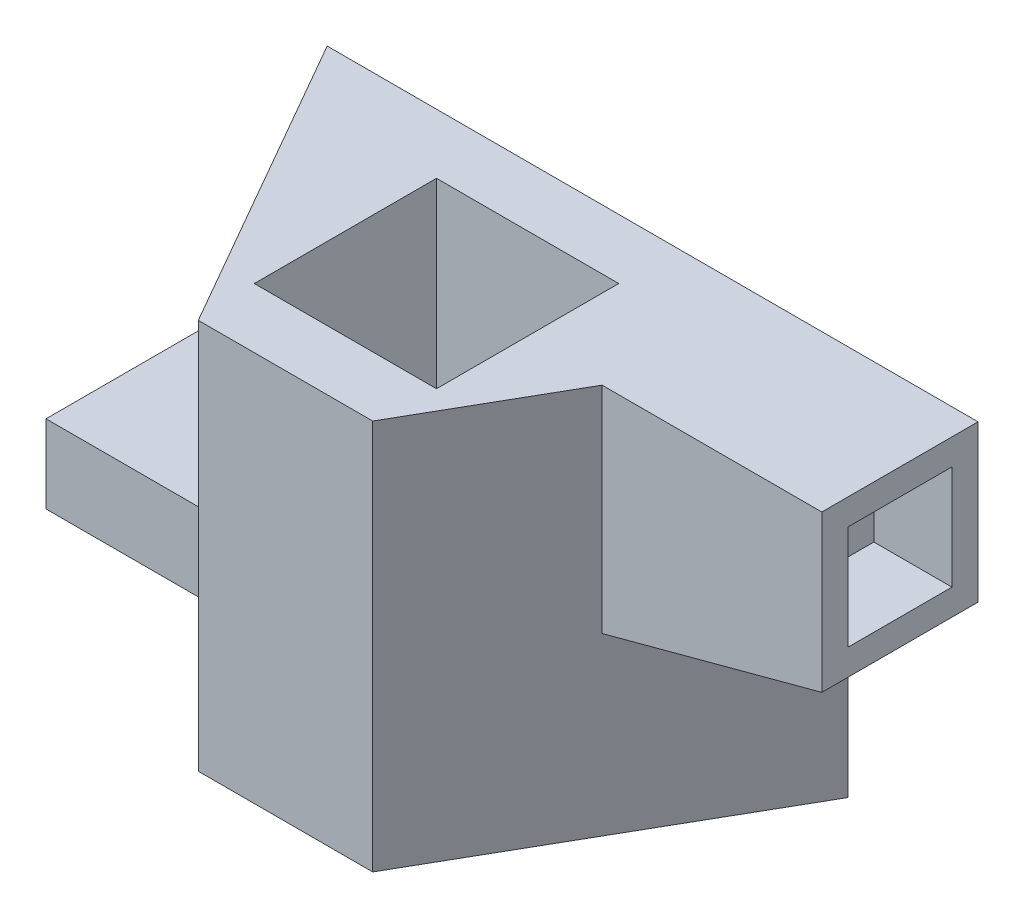
ISO-10303-21;
HEADER;
FILE_DESCRIPTION(('STEP AP214'),'2;1');
FILE_NAME('part.step','',(''),(''),'','','');
FILE_SCHEMA(('AUTOMOTIVE_DESIGN { 1 0 10303 214 1 1 1 1 }'));
ENDSEC;
DATA;
#1=APPLICATION_CONTEXT('core data for automotive mechanical design processes');
#2=APPLICATION_PROTOCOL_DEFINITION('international standard','automotive_design',2000,#1);
#3=PRODUCT_CONTEXT('',#1,'mechanical');
#4=PRODUCT('Part','Part','',(#3));
#5=PRODUCT_RELATED_PRODUCT_CATEGORY('part','',(#4));
#6=PRODUCT_DEFINITION_FORMATION('','',#4);
#7=PRODUCT_DEFINITION_CONTEXT('part definition',#1,'design');
#8=PRODUCT_DEFINITION('design','',#6,#7);
#9=PRODUCT_DEFINITION_SHAPE('','',#8);
#10=(LENGTH_UNIT() NAMED_UNIT(*) SI_UNIT(.MILLI.,.METRE.));
#11=(NAMED_UNIT(*) PLANE_ANGLE_UNIT() SI_UNIT($,.RADIAN.));
#12=(NAMED_UNIT(*) SI_UNIT($,.STERADIAN.) SOLID_ANGLE_UNIT());
#13=UNCERTAINTY_MEASURE_WITH_UNIT(LENGTH_MEASURE(1.E-05),#10,'distance_accuracy_value','');
#14=(GEOMETRIC_REPRESENTATION_CONTEXT(3) GLOBAL_UNCERTAINTY_ASSIGNED_CONTEXT((#13)) GLOBAL_UNIT_ASSIGNED_CONTEXT((#10,
#11,#12)) REPRESENTATION_CONTEXT('',''));
#15=CARTESIAN_POINT('',(0.,0.,0.));
#16=DIRECTION('',(0.,0.,1.));
#17=DIRECTION('',(1.,0.,0.));
#18=AXIS2_PLACEMENT_3D('',#15,#16,#17);
#19=CARTESIAN_POINT('',(0.,-30.,0.));
#20=DIRECTION('',(0.867551941954088,0.,0.497346587413335));
#21=DIRECTION('',(0.497346587413335,0.,-0.867551941954089));
#22=AXIS2_PLACEMENT_3D('',#19,#20,#21);
#23=PLANE('',#22);
#24=DIRECTION('',(0.492988315165272,0.132095820926511,-0.859949542243182));
#25=VECTOR('',#24,1.);
#26=CARTESIAN_POINT('',(-4.98848736259163,45.2658792181849,8.7017223167012));
#27=LINE('',#26,#25);
#28=CARTESIAN_POINT('',(-34.3965517241379,37.3860121215463,60.));
#29=VERTEX_POINT('',#28);
#30=CARTESIAN_POINT('',(0.,46.6025403784442,0.));
#31=VERTEX_POINT('',#30);
#32=EDGE_CURVE('E591',#29,#31,#27,.T.);
#33=ORIENTED_EDGE('',*,*,#32,.F.);
#34=DIRECTION('',(0.,-1.,0.));
#35=VECTOR('',#34,1.);
#36=CARTESIAN_POINT('',(-34.3965517241379,0.,60.));
#37=LINE('',#36,#35);
#38=CARTESIAN_POINT('',(-34.3965517241379,120.,60.));
#39=VERTEX_POINT('',#38);
#40=EDGE_CURVE('E63',#39,#29,#37,.T.);
#41=ORIENTED_EDGE('',*,*,#40,.F.);
#42=DIRECTION('',(0.497346587413335,0.,-0.867551941954089));
#43=VECTOR('',#42,1.);
#44=CARTESIAN_POINT('',(0.,120.,0.));
#45=LINE('',#44,#43);
#46=CARTESIAN_POINT('',(-66.5,120.,116.));
#47=VERTEX_POINT('',#46);
#48=EDGE_CURVE('E206',#47,#39,#45,.T.);
#49=ORIENTED_EDGE('',*,*,#48,.F.);
#50=DIRECTION('',(0.,1.,0.));
#51=VECTOR('',#50,1.);
#52=CARTESIAN_POINT('',(-66.5,-30.,116.));
#53=LINE('',#52,#51);
#54=CARTESIAN_POINT('',(-66.5,-30.,116.));
#55=VERTEX_POINT('',#54);
#56=EDGE_CURVE('E292',#55,#47,#53,.T.);
#57=ORIENTED_EDGE('',*,*,#56,.F.);
#58=DIRECTION('',(0.497346587413335,0.,-0.867551941954088));
#59=VECTOR('',#58,1.);
#60=CARTESIAN_POINT('',(0.,-30.,0.));
#61=LINE('',#60,#59);
#62=CARTESIAN_POINT('',(0.,-30.,0.));
#63=VERTEX_POINT('',#62);
#64=EDGE_CURVE('E238',#55,#63,#61,.T.);
#65=ORIENTED_EDGE('',*,*,#64,.T.);
#66=DIRECTION('',(0.,1.,0.));
#67=VECTOR('',#66,1.);
#68=CARTESIAN_POINT('',(0.,-30.,0.));
#69=LINE('',#68,#67);
#70=EDGE_CURVE('E289',#63,#31,#69,.T.);
#71=ORIENTED_EDGE('',*,*,#70,.T.);
#72=EDGE_LOOP('',(#33,#41,#49,#57,#65,#71));
#73=FACE_BOUND('',#72,.T.);
#74=ADVANCED_FACE('F38',(#73),#23,.T.);
#75=CARTESIAN_POINT('',(0.,0.,0.));
#76=DIRECTION('',(0.,1.,0.));
#77=DIRECTION('',(0.,0.,1.));
#78=AXIS2_PLACEMENT_3D('',#75,#76,#77);
#79=PLANE('',#78);
#80=DIRECTION('',(1.,0.,0.));
#81=VECTOR('',#80,1.);
#82=CARTESIAN_POINT('',(0.,0.,58.));
#83=LINE('',#82,#81);
#84=CARTESIAN_POINT('',(-250.,0.,58.));
#85=VERTEX_POINT('',#84);
#86=CARTESIAN_POINT('',(-166.75,0.,58.0000000000001));
#87=VERTEX_POINT('',#86);
#88=EDGE_CURVE('E228',#85,#87,#83,.T.);
#89=ORIENTED_EDGE('',*,*,#88,.T.);
#90=DIRECTION('',(-0.497346587413335,0.,-0.867551941954088));
#91=VECTOR('',#90,1.);
#92=CARTESIAN_POINT('',(-150.529274397662,0.,86.2947995469355));
#93=LINE('',#92,#91);
#94=CARTESIAN_POINT('',(-200.,0.,0.));
#95=VERTEX_POINT('',#94);
#96=EDGE_CURVE('E12',#87,#95,#93,.T.);
#97=ORIENTED_EDGE('',*,*,#96,.T.);
#98=DIRECTION('',(0.,0.,-1.));
#99=VECTOR('',#98,1.);
#100=CARTESIAN_POINT('',(-200.,0.,0.));
#101=LINE('',#100,#99);
#102=CARTESIAN_POINT('',(-200.,0.,-80.));
#103=VERTEX_POINT('',#102);
#104=EDGE_CURVE('E265',#95,#103,#101,.T.);
#105=ORIENTED_EDGE('',*,*,#104,.T.);
#106=DIRECTION('',(-1.,0.,0.));
#107=VECTOR('',#106,1.);
#108=CARTESIAN_POINT('',(0.,0.,-80.));
#109=LINE('',#108,#107);
#110=CARTESIAN_POINT('',(-250.,0.,-80.));
#111=VERTEX_POINT('',#110);
#112=EDGE_CURVE('E268',#103,#111,#109,.T.);
#113=ORIENTED_EDGE('',*,*,#112,.T.);
#114=DIRECTION('',(0.,0.,1.));
#115=VECTOR('',#114,1.);
#116=CARTESIAN_POINT('',(-250.,0.,0.));
#117=LINE('',#116,#115);
#118=EDGE_CURVE('E233',#111,#85,#117,.T.);
#119=ORIENTED_EDGE('',*,*,#118,.T.);
#120=EDGE_LOOP('',(#89,#97,#105,#113,#119));
#121=FACE_BOUND('',#120,.T.);
#122=ADVANCED_FACE('F303',(#121),#79,.T.);
#123=CARTESIAN_POINT('',(-65.,-30.,0.));
#124=DIRECTION('',(1.,0.,0.));
#125=DIRECTION('',(0.,0.,-1.));
#126=AXIS2_PLACEMENT_3D('',#123,#124,#125);
#127=PLANE('',#126);
#128=DIRECTION('',(0.,1.,0.));
#129=VECTOR('',#128,1.);
#130=CARTESIAN_POINT('',(-65.,-30.,93.));
#131=LINE('',#130,#129);
#132=CARTESIAN_POINT('',(-65.,-30.,93.));
#133=VERTEX_POINT('',#132);
#134=CARTESIAN_POINT('',(-65.,120.,93.));
#135=VERTEX_POINT('',#134);
#136=EDGE_CURVE('E278',#133,#135,#131,.T.);
#137=ORIENTED_EDGE('',*,*,#136,.T.);
#138=DIRECTION('',(0.,0.,-1.));
#139=VECTOR('',#138,1.);
#140=CARTESIAN_POINT('',(-65.,120.,0.));
#141=LINE('',#140,#139);
#142=CARTESIAN_POINT('',(-65.,120.,23.));
#143=VERTEX_POINT('',#142);
#144=EDGE_CURVE('E220',#135,#143,#141,.T.);
#145=ORIENTED_EDGE('',*,*,#144,.T.);
#146=DIRECTION('',(0.,1.,0.));
#147=VECTOR('',#146,1.);
#148=CARTESIAN_POINT('',(-65.,-30.,23.));
#149=LINE('',#148,#147);
#150=CARTESIAN_POINT('',(-65.,-30.,23.));
#151=VERTEX_POINT('',#150);
#152=EDGE_CURVE('E47',#151,#143,#149,.T.);
#153=ORIENTED_EDGE('',*,*,#152,.F.);
#154=DIRECTION('',(0.,0.,-1.));
#155=VECTOR('',#154,1.);
#156=CARTESIAN_POINT('',(-65.,-30.,0.));
#157=LINE('',#156,#155);
#158=EDGE_CURVE('E253',#133,#151,#157,.T.);
#159=ORIENTED_EDGE('',*,*,#158,.F.);
#160=EDGE_LOOP('',(#137,#145,#153,#159));
#161=FACE_BOUND('',#160,.T.);
#162=ADVANCED_FACE('F333',(#161),#127,.F.);
#163=CARTESIAN_POINT('',(0.,-30.,23.));
#164=DIRECTION('',(0.,0.,1.));
#165=DIRECTION('',(1.,0.,0.));
#166=AXIS2_PLACEMENT_3D('',#163,#164,#165);
#167=PLANE('',#166);
#168=ORIENTED_EDGE('',*,*,#152,.T.);
#169=DIRECTION('',(1.,0.,0.));
#170=VECTOR('',#169,1.);
#171=CARTESIAN_POINT('',(0.,120.,23.));
#172=LINE('',#171,#170);
#173=CARTESIAN_POINT('',(-135.,120.,23.));
#174=VERTEX_POINT('',#173);
#175=EDGE_CURVE('E211',#174,#143,#172,.T.);
#176=ORIENTED_EDGE('',*,*,#175,.F.);
#177=DIRECTION('',(0.,1.,0.));
#178=VECTOR('',#177,1.);
#179=CARTESIAN_POINT('',(-135.,-30.,23.));
#180=LINE('',#179,#178);
#181=CARTESIAN_POINT('',(-135.,-30.,23.));
#182=VERTEX_POINT('',#181);
#183=EDGE_CURVE('E274',#182,#174,#180,.T.);
#184=ORIENTED_EDGE('',*,*,#183,.F.);
#185=DIRECTION('',(1.,0.,0.));
#186=VECTOR('',#185,1.);
#187=CARTESIAN_POINT('',(0.,-30.,23.));
#188=LINE('',#187,#186);
#189=EDGE_CURVE('E260',#182,#151,#188,.T.);
#190=ORIENTED_EDGE('',*,*,#189,.T.);
#191=EDGE_LOOP('',(#168,#176,#184,#190));
#192=FACE_BOUND('',#191,.T.);
#193=ADVANCED_FACE('F350',(#192),#167,.T.);
#194=CARTESIAN_POINT('',(-135.,-30.,0.));
#195=DIRECTION('',(1.,0.,0.));
#196=DIRECTION('',(0.,0.,-1.));
#197=AXIS2_PLACEMENT_3D('',#194,#195,#196);
#198=PLANE('',#197);
#199=ORIENTED_EDGE('',*,*,#183,.T.);
#200=DIRECTION('',(0.,0.,-1.));
#201=VECTOR('',#200,1.);
#202=CARTESIAN_POINT('',(-135.,120.,0.));
#203=LINE('',#202,#201);
#204=CARTESIAN_POINT('',(-135.,120.,93.));
#205=VERTEX_POINT('',#204);
#206=EDGE_CURVE('E214',#205,#174,#203,.T.);
#207=ORIENTED_EDGE('',*,*,#206,.F.);
#208=DIRECTION('',(0.,1.,0.));
#209=VECTOR('',#208,1.);
#210=CARTESIAN_POINT('',(-135.,-30.,93.));
#211=LINE('',#210,#209);
#212=CARTESIAN_POINT('',(-135.,-30.,93.));
#213=VERTEX_POINT('',#212);
#214=EDGE_CURVE('E276',#213,#205,#211,.T.);
#215=ORIENTED_EDGE('',*,*,#214,.F.);
#216=DIRECTION('',(0.,0.,-1.));
#217=VECTOR('',#216,1.);
#218=CARTESIAN_POINT('',(-135.,-30.,0.));
#219=LINE('',#218,#217);
#220=EDGE_CURVE('E257',#213,#182,#219,.T.);
#221=ORIENTED_EDGE('',*,*,#220,.T.);
#222=EDGE_LOOP('',(#199,#207,#215,#221));
#223=FACE_BOUND('',#222,.T.);
#224=ADVANCED_FACE('F353',(#223),#198,.T.);
#225=CARTESIAN_POINT('',(0.,-30.,58.));
#226=DIRECTION('',(0.,0.,1.));
#227=DIRECTION('',(1.,0.,0.));
#228=AXIS2_PLACEMENT_3D('',#225,#226,#227);
#229=PLANE('',#228);
#230=ORIENTED_EDGE('',*,*,#88,.F.);
#231=DIRECTION('',(0.,1.,0.));
#232=VECTOR('',#231,1.);
#233=CARTESIAN_POINT('',(-250.,-30.,58.));
#234=LINE('',#233,#232);
#235=CARTESIAN_POINT('',(-250.,-30.,58.));
#236=VERTEX_POINT('',#235);
#237=EDGE_CURVE('E280',#236,#85,#234,.T.);
#238=ORIENTED_EDGE('',*,*,#237,.F.);
#239=DIRECTION('',(1.,0.,0.));
#240=VECTOR('',#239,1.);
#241=CARTESIAN_POINT('',(0.,-30.,58.));
#242=LINE('',#241,#240);
#243=CARTESIAN_POINT('',(-166.75,-30.,58.));
#244=VERTEX_POINT('',#243);
#245=EDGE_CURVE('E229',#236,#244,#242,.T.);
#246=ORIENTED_EDGE('',*,*,#245,.T.);
#247=DIRECTION('',(0.,1.,0.));
#248=VECTOR('',#247,1.);
#249=CARTESIAN_POINT('',(-166.75,-30.,58.));
#250=LINE('',#249,#248);
#251=EDGE_CURVE('E42',#244,#87,#250,.T.);
#252=ORIENTED_EDGE('',*,*,#251,.T.);
#253=EDGE_LOOP('',(#230,#238,#246,#252));
#254=FACE_BOUND('',#253,.T.);
#255=ADVANCED_FACE('F40',(#254),#229,.T.);
#256=CARTESIAN_POINT('',(-250.,-30.,0.));
#257=DIRECTION('',(-1.,0.,0.));
#258=DIRECTION('',(0.,0.,1.));
#259=AXIS2_PLACEMENT_3D('',#256,#257,#258);
#260=PLANE('',#259);
#261=ORIENTED_EDGE('',*,*,#118,.F.);
#262=DIRECTION('',(0.,1.,0.));
#263=VECTOR('',#262,1.);
#264=CARTESIAN_POINT('',(-250.,-30.,-80.));
#265=LINE('',#264,#263);
#266=CARTESIAN_POINT('',(-250.,-30.,-80.));
#267=VERTEX_POINT('',#266);
#268=EDGE_CURVE('E282',#267,#111,#265,.T.);
#269=ORIENTED_EDGE('',*,*,#268,.F.);
#270=DIRECTION('',(0.,0.,1.));
#271=VECTOR('',#270,1.);
#272=CARTESIAN_POINT('',(-250.,-30.,0.));
#273=LINE('',#272,#271);
#274=EDGE_CURVE('E250',#267,#236,#273,.T.);
#275=ORIENTED_EDGE('',*,*,#274,.T.);
#276=ORIENTED_EDGE('',*,*,#237,.T.);
#277=EDGE_LOOP('',(#261,#269,#275,#276));
#278=FACE_BOUND('',#277,.T.);
#279=ADVANCED_FACE('F307',(#278),#260,.T.);
#280=CARTESIAN_POINT('',(0.,-30.,-80.));
#281=DIRECTION('',(0.,0.,-1.));
#282=DIRECTION('',(-1.,0.,0.));
#283=AXIS2_PLACEMENT_3D('',#280,#281,#282);
#284=PLANE('',#283);
#285=ORIENTED_EDGE('',*,*,#112,.F.);
#286=DIRECTION('',(0.,1.,0.));
#287=VECTOR('',#286,1.);
#288=CARTESIAN_POINT('',(-200.,-30.,-80.));
#289=LINE('',#288,#287);
#290=CARTESIAN_POINT('',(-200.,-30.,-80.));
#291=VERTEX_POINT('',#290);
#292=EDGE_CURVE('E284',#291,#103,#289,.T.);
#293=ORIENTED_EDGE('',*,*,#292,.F.);
#294=DIRECTION('',(-1.,0.,0.));
#295=VECTOR('',#294,1.);
#296=CARTESIAN_POINT('',(0.,-30.,-80.));
#297=LINE('',#296,#295);
#298=EDGE_CURVE('E247',#291,#267,#297,.T.);
#299=ORIENTED_EDGE('',*,*,#298,.T.);
#300=ORIENTED_EDGE('',*,*,#268,.T.);
#301=EDGE_LOOP('',(#285,#293,#299,#300));
#302=FACE_BOUND('',#301,.T.);
#303=ADVANCED_FACE('F342',(#302),#284,.T.);
#304=CARTESIAN_POINT('',(-200.,-30.,0.));
#305=DIRECTION('',(1.,0.,0.));
#306=DIRECTION('',(0.,0.,-1.));
#307=AXIS2_PLACEMENT_3D('',#304,#305,#306);
#308=PLANE('',#307);
#309=ORIENTED_EDGE('',*,*,#104,.F.);
#310=DIRECTION('',(0.,1.,0.));
#311=VECTOR('',#310,1.);
#312=CARTESIAN_POINT('',(-200.,-30.,0.));
#313=LINE('',#312,#311);
#314=CARTESIAN_POINT('',(-200.,-30.,0.));
#315=VERTEX_POINT('',#314);
#316=EDGE_CURVE('E286',#315,#95,#313,.T.);
#317=ORIENTED_EDGE('',*,*,#316,.F.);
#318=DIRECTION('',(0.,0.,-1.));
#319=VECTOR('',#318,1.);
#320=CARTESIAN_POINT('',(-200.,-30.,0.));
#321=LINE('',#320,#319);
#322=EDGE_CURVE('E244',#315,#291,#321,.T.);
#323=ORIENTED_EDGE('',*,*,#322,.T.);
#324=ORIENTED_EDGE('',*,*,#292,.T.);
#325=EDGE_LOOP('',(#309,#317,#323,#324));
#326=FACE_BOUND('',#325,.T.);
#327=ADVANCED_FACE('F338',(#326),#308,.T.);
#328=CARTESIAN_POINT('',(0.,-30.,0.));
#329=DIRECTION('',(0.,0.,-1.));
#330=DIRECTION('',(-1.,0.,0.));
#331=AXIS2_PLACEMENT_3D('',#328,#329,#330);
#332=PLANE('',#331);
#333=DIRECTION('',(0.96592582628907,0.258819045102515,0.));
#334=VECTOR('',#333,1.);
#335=CARTESIAN_POINT('',(50.,60.,0.));
#336=LINE('',#335,#334);
#337=CARTESIAN_POINT('',(50.,60.,0.));
#338=VERTEX_POINT('',#337);
#339=EDGE_CURVE('E180',#31,#338,#336,.T.);
#340=ORIENTED_EDGE('',*,*,#339,.F.);
#341=ORIENTED_EDGE('',*,*,#70,.F.);
#342=DIRECTION('',(-1.,0.,0.));
#343=VECTOR('',#342,1.);
#344=CARTESIAN_POINT('',(0.,-30.,0.));
#345=LINE('',#344,#343);
#346=EDGE_CURVE('E241',#63,#315,#345,.T.);
#347=ORIENTED_EDGE('',*,*,#346,.T.);
#348=ORIENTED_EDGE('',*,*,#316,.T.);
#349=DIRECTION('',(0.,-1.,0.));
#350=VECTOR('',#349,1.);
#351=CARTESIAN_POINT('',(-200.,501.205536265895,0.));
#352=LINE('',#351,#350);
#353=CARTESIAN_POINT('',(-200.,120.,0.));
#354=VERTEX_POINT('',#353);
#355=EDGE_CURVE('E222',#354,#95,#352,.T.);
#356=ORIENTED_EDGE('',*,*,#355,.F.);
#357=DIRECTION('',(-1.,0.,0.));
#358=VECTOR('',#357,1.);
#359=CARTESIAN_POINT('',(0.,120.,0.));
#360=LINE('',#359,#358);
#361=CARTESIAN_POINT('',(50.,120.,0.));
#362=VERTEX_POINT('',#361);
#363=EDGE_CURVE('E204',#362,#354,#360,.T.);
#364=ORIENTED_EDGE('',*,*,#363,.F.);
#365=DIRECTION('',(0.,1.,0.));
#366=VECTOR('',#365,1.);
#367=CARTESIAN_POINT('',(50.,0.,0.));
#368=LINE('',#367,#366);
#369=EDGE_CURVE('E185',#338,#362,#368,.T.);
#370=ORIENTED_EDGE('',*,*,#369,.F.);
#371=EDGE_LOOP('',(#340,#341,#347,#348,#356,#364,#370));
#372=FACE_BOUND('',#371,.T.);
#373=ADVANCED_FACE('F325',(#372),#332,.T.);
#374=CARTESIAN_POINT('',(0.,-30.,116.));
#375=DIRECTION('',(0.,0.,1.));
#376=DIRECTION('',(1.,0.,0.));
#377=AXIS2_PLACEMENT_3D('',#374,#375,#376);
#378=PLANE('',#377);
#379=ORIENTED_EDGE('',*,*,#56,.T.);
#380=DIRECTION('',(1.,0.,0.));
#381=VECTOR('',#380,1.);
#382=CARTESIAN_POINT('',(0.,120.,116.));
#383=LINE('',#382,#381);
#384=CARTESIAN_POINT('',(-133.5,120.,116.));
#385=VERTEX_POINT('',#384);
#386=EDGE_CURVE('E208',#385,#47,#383,.T.);
#387=ORIENTED_EDGE('',*,*,#386,.F.);
#388=DIRECTION('',(0.,1.,0.));
#389=VECTOR('',#388,1.);
#390=CARTESIAN_POINT('',(-133.5,-30.,116.));
#391=LINE('',#390,#389);
#392=CARTESIAN_POINT('',(-133.5,-30.,116.));
#393=VERTEX_POINT('',#392);
#394=EDGE_CURVE('E293',#393,#385,#391,.T.);
#395=ORIENTED_EDGE('',*,*,#394,.F.);
#396=DIRECTION('',(1.,0.,0.));
#397=VECTOR('',#396,1.);
#398=CARTESIAN_POINT('',(0.,-30.,116.));
#399=LINE('',#398,#397);
#400=EDGE_CURVE('E235',#393,#55,#399,.T.);
#401=ORIENTED_EDGE('',*,*,#400,.T.);
#402=EDGE_LOOP('',(#379,#387,#395,#401));
#403=FACE_BOUND('',#402,.T.);
#404=ADVANCED_FACE('F318',(#403),#378,.T.);
#405=CARTESIAN_POINT('',(-150.529274397662,-30.,86.2947995469355));
#406=DIRECTION('',(0.867551941954088,0.,-0.497346587413335));
#407=DIRECTION('',(-0.497346587413335,0.,-0.867551941954089));
#408=AXIS2_PLACEMENT_3D('',#405,#406,#407);
#409=PLANE('',#408);
#410=ORIENTED_EDGE('',*,*,#394,.T.);
#411=DIRECTION('',(-0.497346587413335,0.,-0.867551941954088));
#412=VECTOR('',#411,1.);
#413=CARTESIAN_POINT('',(-150.529274397662,120.,86.2947995469355));
#414=LINE('',#413,#412);
#415=EDGE_CURVE('E225',#385,#354,#414,.T.);
#416=ORIENTED_EDGE('',*,*,#415,.T.);
#417=ORIENTED_EDGE('',*,*,#355,.T.);
#418=ORIENTED_EDGE('',*,*,#96,.F.);
#419=ORIENTED_EDGE('',*,*,#251,.F.);
#420=DIRECTION('',(-0.497346587413335,0.,-0.867551941954088));
#421=VECTOR('',#420,1.);
#422=CARTESIAN_POINT('',(-150.529274397662,-30.,86.2947995469355));
#423=LINE('',#422,#421);
#424=EDGE_CURVE('E232',#393,#244,#423,.T.);
#425=ORIENTED_EDGE('',*,*,#424,.F.);
#426=EDGE_LOOP('',(#410,#416,#417,#418,#419,#425));
#427=FACE_BOUND('',#426,.T.);
#428=ADVANCED_FACE('F315',(#427),#409,.F.);
#429=CARTESIAN_POINT('',(0.,-30.,93.));
#430=DIRECTION('',(0.,0.,1.));
#431=DIRECTION('',(1.,0.,0.));
#432=AXIS2_PLACEMENT_3D('',#429,#430,#431);
#433=PLANE('',#432);
#434=ORIENTED_EDGE('',*,*,#214,.T.);
#435=DIRECTION('',(1.,0.,0.));
#436=VECTOR('',#435,1.);
#437=CARTESIAN_POINT('',(0.,120.,93.));
#438=LINE('',#437,#436);
#439=EDGE_CURVE('E217',#205,#135,#438,.T.);
#440=ORIENTED_EDGE('',*,*,#439,.T.);
#441=ORIENTED_EDGE('',*,*,#136,.F.);
#442=DIRECTION('',(1.,0.,0.));
#443=VECTOR('',#442,1.);
#444=CARTESIAN_POINT('',(0.,-30.,93.));
#445=LINE('',#444,#443);
#446=EDGE_CURVE('E255',#213,#133,#445,.T.);
#447=ORIENTED_EDGE('',*,*,#446,.F.);
#448=EDGE_LOOP('',(#434,#440,#441,#447));
#449=FACE_BOUND('',#448,.T.);
#450=ADVANCED_FACE('F317',(#449),#433,.F.);
#451=CARTESIAN_POINT('',(0.,-30.,0.));
#452=DIRECTION('',(0.,1.,0.));
#453=DIRECTION('',(0.,0.,1.));
#454=AXIS2_PLACEMENT_3D('',#451,#452,#453);
#455=PLANE('',#454);
#456=ORIENTED_EDGE('',*,*,#245,.F.);
#457=ORIENTED_EDGE('',*,*,#274,.F.);
#458=ORIENTED_EDGE('',*,*,#298,.F.);
#459=ORIENTED_EDGE('',*,*,#322,.F.);
#460=ORIENTED_EDGE('',*,*,#346,.F.);
#461=ORIENTED_EDGE('',*,*,#64,.F.);
#462=ORIENTED_EDGE('',*,*,#400,.F.);
#463=ORIENTED_EDGE('',*,*,#424,.T.);
#464=EDGE_LOOP('',(#456,#457,#458,#459,#460,#461,#462,#463));
#465=FACE_BOUND('',#464,.T.);
#466=ORIENTED_EDGE('',*,*,#158,.T.);
#467=ORIENTED_EDGE('',*,*,#189,.F.);
#468=ORIENTED_EDGE('',*,*,#220,.F.);
#469=ORIENTED_EDGE('',*,*,#446,.T.);
#470=EDGE_LOOP('',(#466,#467,#468,#469));
#471=FACE_BOUND('',#470,.T.);
#472=ADVANCED_FACE('F310',(#465,#471),#455,.F.);
#473=CARTESIAN_POINT('',(0.,120.,0.));
#474=DIRECTION('',(0.,1.,0.));
#475=DIRECTION('',(0.,0.,1.));
#476=AXIS2_PLACEMENT_3D('',#473,#474,#475);
#477=PLANE('',#476);
#478=ORIENTED_EDGE('',*,*,#144,.F.);
#479=ORIENTED_EDGE('',*,*,#439,.F.);
#480=ORIENTED_EDGE('',*,*,#206,.T.);
#481=ORIENTED_EDGE('',*,*,#175,.T.);
#482=EDGE_LOOP('',(#478,#479,#480,#481));
#483=FACE_BOUND('',#482,.T.);
#484=ORIENTED_EDGE('',*,*,#415,.F.);
#485=ORIENTED_EDGE('',*,*,#386,.T.);
#486=ORIENTED_EDGE('',*,*,#48,.T.);
#487=DIRECTION('',(1.,0.,0.));
#488=VECTOR('',#487,1.);
#489=CARTESIAN_POINT('',(-108.528275497553,120.,60.));
#490=LINE('',#489,#488);
#491=CARTESIAN_POINT('',(50.,120.,60.));
#492=VERTEX_POINT('',#491);
#493=EDGE_CURVE('E198',#39,#492,#490,.T.);
#494=ORIENTED_EDGE('',*,*,#493,.T.);
#495=DIRECTION('',(0.,0.,-1.));
#496=VECTOR('',#495,1.);
#497=CARTESIAN_POINT('',(50.,120.,0.));
#498=LINE('',#497,#496);
#499=EDGE_CURVE('E197',#492,#362,#498,.T.);
#500=ORIENTED_EDGE('',*,*,#499,.T.);
#501=ORIENTED_EDGE('',*,*,#363,.T.);
#502=EDGE_LOOP('',(#484,#485,#486,#494,#500,#501));
#503=FACE_BOUND('',#502,.T.);
#504=ADVANCED_FACE('F362',(#483,#503),#477,.T.);
#505=CARTESIAN_POINT('',(-108.528275497553,0.,60.));
#506=DIRECTION('',(0.,0.,-1.));
#507=DIRECTION('',(0.,1.,0.));
#508=AXIS2_PLACEMENT_3D('',#505,#506,#507);
#509=PLANE('',#508);
#510=ORIENTED_EDGE('',*,*,#493,.F.);
#511=ORIENTED_EDGE('',*,*,#40,.T.);
#512=DIRECTION('',(0.96592582628907,0.258819045102515,0.));
#513=VECTOR('',#512,1.);
#514=CARTESIAN_POINT('',(50.,60.,60.));
#515=LINE('',#514,#513);
#516=CARTESIAN_POINT('',(50.,60.,60.));
#517=VERTEX_POINT('',#516);
#518=EDGE_CURVE('E178',#29,#517,#515,.T.);
#519=ORIENTED_EDGE('',*,*,#518,.T.);
#520=DIRECTION('',(0.,1.,0.));
#521=VECTOR('',#520,1.);
#522=CARTESIAN_POINT('',(50.,0.,60.));
#523=LINE('',#522,#521);
#524=EDGE_CURVE('E192',#517,#492,#523,.T.);
#525=ORIENTED_EDGE('',*,*,#524,.T.);
#526=EDGE_LOOP('',(#510,#511,#519,#525));
#527=FACE_BOUND('',#526,.T.);
#528=ADVANCED_FACE('F191',(#527),#509,.F.);
#529=CARTESIAN_POINT('',(50.,0.,0.));
#530=DIRECTION('',(1.,0.,0.));
#531=DIRECTION('',(0.,0.,-1.));
#532=AXIS2_PLACEMENT_3D('',#529,#530,#531);
#533=PLANE('',#532);
#534=DIRECTION('',(0.,0.,-1.));
#535=VECTOR('',#534,1.);
#536=CARTESIAN_POINT('',(50.,70.,0.));
#537=LINE('',#536,#535);
#538=CARTESIAN_POINT('',(50.,70.,50.));
#539=VERTEX_POINT('',#538);
#540=CARTESIAN_POINT('',(50.,70.,9.99999999999999));
#541=VERTEX_POINT('',#540);
#542=EDGE_CURVE('E55',#539,#541,#537,.T.);
#543=ORIENTED_EDGE('',*,*,#542,.F.);
#544=DIRECTION('',(0.,1.,0.));
#545=VECTOR('',#544,1.);
#546=CARTESIAN_POINT('',(50.,0.,50.));
#547=LINE('',#546,#545);
#548=CARTESIAN_POINT('',(50.,110.,50.));
#549=VERTEX_POINT('',#548);
#550=EDGE_CURVE('E583',#539,#549,#547,.T.);
#551=ORIENTED_EDGE('',*,*,#550,.T.);
#552=DIRECTION('',(0.,0.,-1.));
#553=VECTOR('',#552,1.);
#554=CARTESIAN_POINT('',(50.,110.,0.));
#555=LINE('',#554,#553);
#556=CARTESIAN_POINT('',(50.,110.,9.99999999999999));
#557=VERTEX_POINT('',#556);
#558=EDGE_CURVE('E588',#549,#557,#555,.T.);
#559=ORIENTED_EDGE('',*,*,#558,.T.);
#560=DIRECTION('',(0.,1.,0.));
#561=VECTOR('',#560,1.);
#562=CARTESIAN_POINT('',(50.,0.,9.99999999999999));
#563=LINE('',#562,#561);
#564=EDGE_CURVE('E598',#541,#557,#563,.T.);
#565=ORIENTED_EDGE('',*,*,#564,.F.);
#566=EDGE_LOOP('',(#543,#551,#559,#565));
#567=FACE_BOUND('',#566,.T.);
#568=DIRECTION('',(0.,0.,-1.));
#569=VECTOR('',#568,1.);
#570=CARTESIAN_POINT('',(50.,60.,0.));
#571=LINE('',#570,#569);
#572=EDGE_CURVE('E175',#517,#338,#571,.T.);
#573=ORIENTED_EDGE('',*,*,#572,.T.);
#574=ORIENTED_EDGE('',*,*,#369,.T.);
#575=ORIENTED_EDGE('',*,*,#499,.F.);
#576=ORIENTED_EDGE('',*,*,#524,.F.);
#577=EDGE_LOOP('',(#573,#574,#575,#576));
#578=FACE_BOUND('',#577,.T.);
#579=ADVANCED_FACE('F195',(#567,#578),#533,.T.);
#580=CARTESIAN_POINT('',(20.,70.,0.));
#581=DIRECTION('',(0.,-1.,0.));
#582=DIRECTION('',(0.,0.,-1.));
#583=AXIS2_PLACEMENT_3D('',#580,#581,#582);
#584=PLANE('',#583);
#585=ORIENTED_EDGE('',*,*,#542,.T.);
#586=DIRECTION('',(1.,0.,0.));
#587=VECTOR('',#586,1.);
#588=CARTESIAN_POINT('',(20.,70.,9.99999999999999));
#589=LINE('',#588,#587);
#590=CARTESIAN_POINT('',(20.,70.,9.99999999999999));
#591=VERTEX_POINT('',#590);
#592=EDGE_CURVE('E596',#591,#541,#589,.T.);
#593=ORIENTED_EDGE('',*,*,#592,.F.);
#594=DIRECTION('',(0.,0.,-1.));
#595=VECTOR('',#594,1.);
#596=CARTESIAN_POINT('',(20.,70.,0.));
#597=LINE('',#596,#595);
#598=CARTESIAN_POINT('',(20.,70.,50.));
#599=VERTEX_POINT('',#598);
#600=EDGE_CURVE('E578',#599,#591,#597,.T.);
#601=ORIENTED_EDGE('',*,*,#600,.F.);
#602=DIRECTION('',(1.,0.,0.));
#603=VECTOR('',#602,1.);
#604=CARTESIAN_POINT('',(20.,70.,50.));
#605=LINE('',#604,#603);
#606=EDGE_CURVE('E186',#599,#539,#605,.T.);
#607=ORIENTED_EDGE('',*,*,#606,.T.);
#608=EDGE_LOOP('',(#585,#593,#601,#607));
#609=FACE_BOUND('',#608,.T.);
#610=ADVANCED_FACE('F370',(#609),#584,.F.);
#611=CARTESIAN_POINT('',(20.,0.,50.));
#612=DIRECTION('',(0.,0.,-1.));
#613=DIRECTION('',(-1.,0.,0.));
#614=AXIS2_PLACEMENT_3D('',#611,#612,#613);
#615=PLANE('',#614);
#616=ORIENTED_EDGE('',*,*,#550,.F.);
#617=ORIENTED_EDGE('',*,*,#606,.F.);
#618=DIRECTION('',(0.,1.,0.));
#619=VECTOR('',#618,1.);
#620=CARTESIAN_POINT('',(20.,0.,50.));
#621=LINE('',#620,#619);
#622=CARTESIAN_POINT('',(20.,110.,50.));
#623=VERTEX_POINT('',#622);
#624=EDGE_CURVE('E582',#599,#623,#621,.T.);
#625=ORIENTED_EDGE('',*,*,#624,.T.);
#626=DIRECTION('',(1.,0.,0.));
#627=VECTOR('',#626,1.);
#628=CARTESIAN_POINT('',(20.,110.,50.));
#629=LINE('',#628,#627);
#630=EDGE_CURVE('E604',#623,#549,#629,.T.);
#631=ORIENTED_EDGE('',*,*,#630,.T.);
#632=EDGE_LOOP('',(#616,#617,#625,#631));
#633=FACE_BOUND('',#632,.T.);
#634=ADVANCED_FACE('F374',(#633),#615,.T.);
#635=CARTESIAN_POINT('',(20.,110.,0.));
#636=DIRECTION('',(0.,-1.,0.));
#637=DIRECTION('',(0.,0.,-1.));
#638=AXIS2_PLACEMENT_3D('',#635,#636,#637);
#639=PLANE('',#638);
#640=ORIENTED_EDGE('',*,*,#558,.F.);
#641=ORIENTED_EDGE('',*,*,#630,.F.);
#642=DIRECTION('',(0.,0.,-1.));
#643=VECTOR('',#642,1.);
#644=CARTESIAN_POINT('',(20.,110.,0.));
#645=LINE('',#644,#643);
#646=CARTESIAN_POINT('',(20.,110.,9.99999999999999));
#647=VERTEX_POINT('',#646);
#648=EDGE_CURVE('E585',#623,#647,#645,.T.);
#649=ORIENTED_EDGE('',*,*,#648,.T.);
#650=DIRECTION('',(1.,0.,0.));
#651=VECTOR('',#650,1.);
#652=CARTESIAN_POINT('',(20.,110.,9.99999999999999));
#653=LINE('',#652,#651);
#654=EDGE_CURVE('E606',#647,#557,#653,.T.);
#655=ORIENTED_EDGE('',*,*,#654,.T.);
#656=EDGE_LOOP('',(#640,#641,#649,#655));
#657=FACE_BOUND('',#656,.T.);
#658=ADVANCED_FACE('F379',(#657),#639,.T.);
#659=CARTESIAN_POINT('',(20.,0.,9.99999999999999));
#660=DIRECTION('',(0.,0.,-1.));
#661=DIRECTION('',(-1.,0.,0.));
#662=AXIS2_PLACEMENT_3D('',#659,#660,#661);
#663=PLANE('',#662);
#664=ORIENTED_EDGE('',*,*,#564,.T.);
#665=ORIENTED_EDGE('',*,*,#654,.F.);
#666=DIRECTION('',(0.,1.,0.));
#667=VECTOR('',#666,1.);
#668=CARTESIAN_POINT('',(20.,0.,9.99999999999999));
#669=LINE('',#668,#667);
#670=EDGE_CURVE('E581',#591,#647,#669,.T.);
#671=ORIENTED_EDGE('',*,*,#670,.F.);
#672=ORIENTED_EDGE('',*,*,#592,.T.);
#673=EDGE_LOOP('',(#664,#665,#671,#672));
#674=FACE_BOUND('',#673,.T.);
#675=ADVANCED_FACE('F375',(#674),#663,.F.);
#676=CARTESIAN_POINT('',(20.,0.,0.));
#677=DIRECTION('',(1.,0.,0.));
#678=DIRECTION('',(0.,0.,-1.));
#679=AXIS2_PLACEMENT_3D('',#676,#677,#678);
#680=PLANE('',#679);
#681=ORIENTED_EDGE('',*,*,#600,.T.);
#682=ORIENTED_EDGE('',*,*,#670,.T.);
#683=ORIENTED_EDGE('',*,*,#648,.F.);
#684=ORIENTED_EDGE('',*,*,#624,.F.);
#685=EDGE_LOOP('',(#681,#682,#683,#684));
#686=FACE_BOUND('',#685,.T.);
#687=ADVANCED_FACE('F378',(#686),#680,.T.);
#688=CARTESIAN_POINT('',(50.,60.,-87.3737397087474));
#689=DIRECTION('',(0.258819045102515,-0.96592582628907,0.));
#690=DIRECTION('',(0.96592582628907,0.258819045102515,0.));
#691=AXIS2_PLACEMENT_3D('',#688,#689,#690);
#692=PLANE('',#691);
#693=ORIENTED_EDGE('',*,*,#518,.F.);
#694=ORIENTED_EDGE('',*,*,#32,.T.);
#695=ORIENTED_EDGE('',*,*,#339,.T.);
#696=ORIENTED_EDGE('',*,*,#572,.F.);
#697=EDGE_LOOP('',(#693,#694,#695,#696));
#698=FACE_BOUND('',#697,.T.);
#699=ADVANCED_FACE('F177',(#698),#692,.T.);
#700=CLOSED_SHELL('',(#74,#122,#162,#193,#224,#255,#279,#303,#327,#373,#404,#428,#450,#472,#504,
#528,#579,#610,#634,#658,#675,#687,#699));
#701=MANIFOLD_SOLID_BREP('B2',#700);
#702=ADVANCED_BREP_SHAPE_REPRESENTATION('',(#18,#701),#14);
#703=SHAPE_DEFINITION_REPRESENTATION(#9,#702);
ENDSEC;
END-ISO-10303-21;
